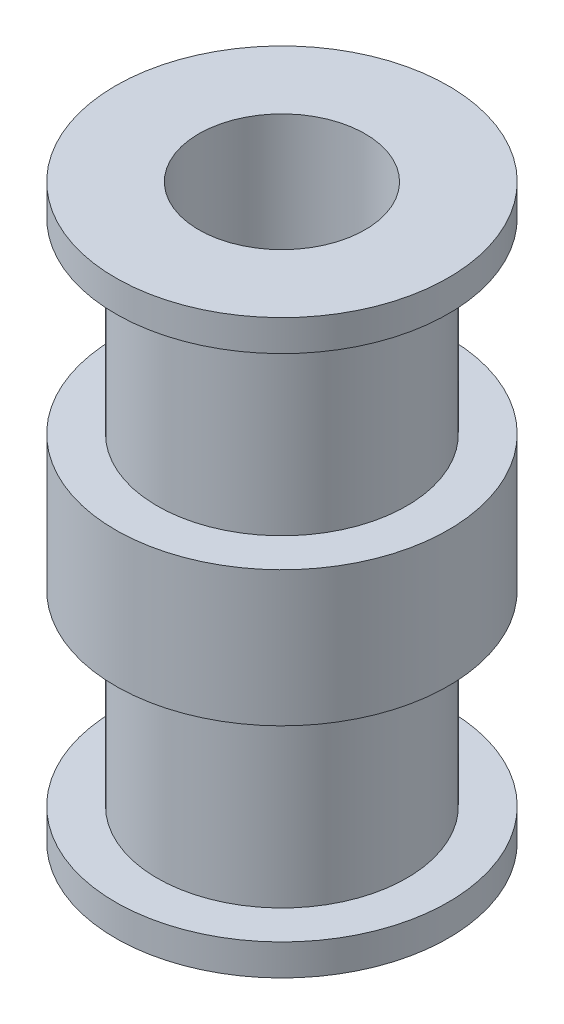
ISO-10303-21;
HEADER;
FILE_DESCRIPTION(('STEP AP214'),'2;1');
FILE_NAME('part.step','',(''),(''),'','','');
FILE_SCHEMA(('AUTOMOTIVE_DESIGN { 1 0 10303 214 1 1 1 1 }'));
ENDSEC;
DATA;
#1=APPLICATION_CONTEXT('core data for automotive mechanical design processes');
#2=APPLICATION_PROTOCOL_DEFINITION('international standard','automotive_design',2000,#1);
#3=PRODUCT_CONTEXT('',#1,'mechanical');
#4=PRODUCT('Part','Part','',(#3));
#5=PRODUCT_RELATED_PRODUCT_CATEGORY('part','',(#4));
#6=PRODUCT_DEFINITION_FORMATION('','',#4);
#7=PRODUCT_DEFINITION_CONTEXT('part definition',#1,'design');
#8=PRODUCT_DEFINITION('design','',#6,#7);
#9=PRODUCT_DEFINITION_SHAPE('','',#8);
#10=(LENGTH_UNIT() NAMED_UNIT(*) SI_UNIT(.MILLI.,.METRE.));
#11=(NAMED_UNIT(*) PLANE_ANGLE_UNIT() SI_UNIT($,.RADIAN.));
#12=(NAMED_UNIT(*) SI_UNIT($,.STERADIAN.) SOLID_ANGLE_UNIT());
#13=UNCERTAINTY_MEASURE_WITH_UNIT(LENGTH_MEASURE(1.E-05),#10,'distance_accuracy_value','');
#14=(GEOMETRIC_REPRESENTATION_CONTEXT(3) GLOBAL_UNCERTAINTY_ASSIGNED_CONTEXT((#13)) GLOBAL_UNIT_ASSIGNED_CONTEXT((#10,
#11,#12)) REPRESENTATION_CONTEXT('',''));
#15=CARTESIAN_POINT('',(0.,0.,0.));
#16=DIRECTION('',(0.,0.,1.));
#17=DIRECTION('',(1.,0.,0.));
#18=AXIS2_PLACEMENT_3D('',#15,#16,#17);
#19=CARTESIAN_POINT('',(0.,-22.5,0.));
#20=DIRECTION('',(0.,-1.,0.));
#21=DIRECTION('',(1.,0.,0.));
#22=AXIS2_PLACEMENT_3D('',#19,#20,#21);
#23=PLANE('',#22);
#24=CARTESIAN_POINT('',(0.,-22.5,0.));
#25=DIRECTION('',(0.,-1.,0.));
#26=DIRECTION('',(1.,0.,0.));
#27=AXIS2_PLACEMENT_3D('',#24,#25,#26);
#28=CIRCLE('',#27,4.);
#29=CARTESIAN_POINT('',(4.,-22.5,0.));
#30=VERTEX_POINT('',#29);
#31=EDGE_CURVE('E87',#30,#30,#28,.F.);
#32=ORIENTED_EDGE('',*,*,#31,.T.);
#33=EDGE_LOOP('',(#32));
#34=FACE_BOUND('',#33,.T.);
#35=CARTESIAN_POINT('',(0.,-22.5,0.));
#36=DIRECTION('',(0.,1.,0.));
#37=DIRECTION('',(-1.,0.,0.));
#38=AXIS2_PLACEMENT_3D('',#35,#36,#37);
#39=CIRCLE('',#38,8.);
#40=CARTESIAN_POINT('',(-7.99999999999996,-22.5,0.));
#41=VERTEX_POINT('',#40);
#42=EDGE_CURVE('E10',#41,#41,#39,.T.);
#43=ORIENTED_EDGE('',*,*,#42,.F.);
#44=EDGE_LOOP('',(#43));
#45=FACE_BOUND('',#44,.T.);
#46=ADVANCED_FACE('F37',(#34,#45),#23,.T.);
#47=CARTESIAN_POINT('',(0.,291.267844828274,0.));
#48=DIRECTION('',(0.,1.,0.));
#49=DIRECTION('',(-1.,0.,0.));
#50=AXIS2_PLACEMENT_3D('',#47,#48,#49);
#51=CYLINDRICAL_SURFACE('',#50,8.);
#52=ORIENTED_EDGE('',*,*,#42,.T.);
#53=EDGE_LOOP('',(#52));
#54=FACE_BOUND('',#53,.T.);
#55=CARTESIAN_POINT('',(0.,-21.,0.));
#56=DIRECTION('',(0.,1.,0.));
#57=DIRECTION('',(-1.,0.,0.));
#58=AXIS2_PLACEMENT_3D('',#55,#56,#57);
#59=CIRCLE('',#58,8.);
#60=CARTESIAN_POINT('',(-7.99999999999996,-21.,0.));
#61=VERTEX_POINT('',#60);
#62=EDGE_CURVE('E50',#61,#61,#59,.T.);
#63=ORIENTED_EDGE('',*,*,#62,.F.);
#64=EDGE_LOOP('',(#63));
#65=FACE_BOUND('',#64,.T.);
#66=ADVANCED_FACE('F112',(#54,#65),#51,.T.);
#67=CARTESIAN_POINT('',(-5.99999999999996,-21.,0.));
#68=DIRECTION('',(0.,1.,0.));
#69=DIRECTION('',(-1.,0.,0.));
#70=AXIS2_PLACEMENT_3D('',#67,#68,#69);
#71=PLANE('',#70);
#72=ORIENTED_EDGE('',*,*,#62,.T.);
#73=EDGE_LOOP('',(#72));
#74=FACE_BOUND('',#73,.T.);
#75=CARTESIAN_POINT('',(0.,-21.,0.));
#76=DIRECTION('',(0.,1.,0.));
#77=DIRECTION('',(-1.,0.,0.));
#78=AXIS2_PLACEMENT_3D('',#75,#76,#77);
#79=CIRCLE('',#78,6.);
#80=CARTESIAN_POINT('',(-5.99999999999996,-21.,0.));
#81=VERTEX_POINT('',#80);
#82=EDGE_CURVE('E56',#81,#81,#79,.T.);
#83=ORIENTED_EDGE('',*,*,#82,.F.);
#84=EDGE_LOOP('',(#83));
#85=FACE_BOUND('',#84,.T.);
#86=ADVANCED_FACE('F109',(#74,#85),#71,.T.);
#87=CARTESIAN_POINT('',(0.,291.267844828274,0.));
#88=DIRECTION('',(0.,1.,0.));
#89=DIRECTION('',(-1.,0.,0.));
#90=AXIS2_PLACEMENT_3D('',#87,#88,#89);
#91=CYLINDRICAL_SURFACE('',#90,6.);
#92=ORIENTED_EDGE('',*,*,#82,.T.);
#93=EDGE_LOOP('',(#92));
#94=FACE_BOUND('',#93,.T.);
#95=CARTESIAN_POINT('',(0.,-12.,0.));
#96=DIRECTION('',(0.,1.,0.));
#97=DIRECTION('',(-1.,0.,0.));
#98=AXIS2_PLACEMENT_3D('',#95,#96,#97);
#99=CIRCLE('',#98,6.);
#100=CARTESIAN_POINT('',(-5.99999999999996,-12.,0.));
#101=VERTEX_POINT('',#100);
#102=EDGE_CURVE('E125',#101,#101,#99,.T.);
#103=ORIENTED_EDGE('',*,*,#102,.F.);
#104=EDGE_LOOP('',(#103));
#105=FACE_BOUND('',#104,.T.);
#106=ADVANCED_FACE('F105',(#94,#105),#91,.T.);
#107=CARTESIAN_POINT('',(-5.99999999999996,-12.,0.));
#108=DIRECTION('',(0.,-1.,0.));
#109=DIRECTION('',(1.,0.,0.));
#110=AXIS2_PLACEMENT_3D('',#107,#108,#109);
#111=PLANE('',#110);
#112=ORIENTED_EDGE('',*,*,#102,.T.);
#113=EDGE_LOOP('',(#112));
#114=FACE_BOUND('',#113,.T.);
#115=CARTESIAN_POINT('',(0.,-12.,0.));
#116=DIRECTION('',(0.,1.,0.));
#117=DIRECTION('',(-1.,0.,0.));
#118=AXIS2_PLACEMENT_3D('',#115,#116,#117);
#119=CIRCLE('',#118,8.);
#120=CARTESIAN_POINT('',(-7.99999999999996,-12.,0.));
#121=VERTEX_POINT('',#120);
#122=EDGE_CURVE('E128',#121,#121,#119,.T.);
#123=ORIENTED_EDGE('',*,*,#122,.F.);
#124=EDGE_LOOP('',(#123));
#125=FACE_BOUND('',#124,.T.);
#126=ADVANCED_FACE('F99',(#114,#125),#111,.T.);
#127=CARTESIAN_POINT('',(0.,291.267844828274,0.));
#128=DIRECTION('',(0.,1.,0.));
#129=DIRECTION('',(-1.,0.,0.));
#130=AXIS2_PLACEMENT_3D('',#127,#128,#129);
#131=CYLINDRICAL_SURFACE('',#130,8.);
#132=CARTESIAN_POINT('',(-7.99999999999996,-10.0701498549836,0.));
#133=CARTESIAN_POINT('',(-7.99999885097238,-10.0701470058478,0.0697575486355165));
#134=CARTESIAN_POINT('',(-7.99907806242866,-10.0642907980968,0.139554702432852));
#135=CARTESIAN_POINT('',(-7.99549349048792,-10.0410280093452,0.277195657489052));
#136=CARTESIAN_POINT('',(-7.99282804422357,-10.0236104087318,0.345037530661659));
#137=CARTESIAN_POINT('',(-7.98605348582884,-9.97776002358029,0.476756269023703));
#138=CARTESIAN_POINT('',(-7.98194549781582,-9.9493358143028,0.540636176144954));
#139=CARTESIAN_POINT('',(-7.97273897019073,-9.8823005824128,0.662710625522304));
#140=CARTESIAN_POINT('',(-7.96764055931272,-9.84369088346563,0.720905905184158));
#141=CARTESIAN_POINT('',(-7.95697134207174,-9.75703333080662,0.830459955825815));
#142=CARTESIAN_POINT('',(-7.95139725696164,-9.70891635753848,0.88176373957133));
#143=CARTESIAN_POINT('',(-7.94043038065139,-9.60475888084916,0.975603844114127));
#144=CARTESIAN_POINT('',(-7.9350376002537,-9.54871790633351,1.01813964327097));
#145=CARTESIAN_POINT('',(-7.92501214063718,-9.42993071931175,1.09345272164443));
#146=CARTESIAN_POINT('',(-7.92038369893048,-9.36715011380272,1.12617636778997));
#147=CARTESIAN_POINT('',(-7.91245600871178,-9.23689914955471,1.18059340798534));
#148=CARTESIAN_POINT('',(-7.90915668151104,-9.16942906872833,1.20228745505034));
#149=CARTESIAN_POINT('',(-7.90429317255514,-9.03229440441172,1.23385779661086));
#150=CARTESIAN_POINT('',(-7.90271513266178,-8.96265206207421,1.2438285274375));
#151=CARTESIAN_POINT('',(-7.90143085535883,-8.82266626053729,1.25196184878814));
#152=CARTESIAN_POINT('',(-7.90172450144007,-8.75232284525059,1.25012517430236));
#153=CARTESIAN_POINT('',(-7.90413775227599,-8.61360133905727,1.23477290404448));
#154=CARTESIAN_POINT('',(-7.90624086092468,-8.54521124330704,1.2213628147985));
#155=CARTESIAN_POINT('',(-7.91201028172732,-8.41166385180395,1.1834096891688));
#156=CARTESIAN_POINT('',(-7.91567664153202,-8.34650665466334,1.1588663134207));
#157=CARTESIAN_POINT('',(-7.92417753427306,-8.22095549864503,1.09923458474696));
#158=CARTESIAN_POINT('',(-7.92901696543617,-8.16058295909708,1.06410186157779));
#159=CARTESIAN_POINT('',(-7.93931523075044,-8.04655008714084,0.984320290733232));
#160=CARTESIAN_POINT('',(-7.94477410894101,-7.99289023253987,0.93967076626513));
#161=CARTESIAN_POINT('',(-7.95576893124444,-7.89319473166695,0.841545444111715));
#162=CARTESIAN_POINT('',(-7.96130506817791,-7.84724827584888,0.787979002802748));
#163=CARTESIAN_POINT('',(-7.97177562673908,-7.76498328216365,0.673848473689734));
#164=CARTESIAN_POINT('',(-7.97671004531007,-7.72866479320519,0.613284350340715));
#165=CARTESIAN_POINT('',(-7.98542699513514,-7.6666808182724,0.486797963528303));
#166=CARTESIAN_POINT('',(-7.98920874270962,-7.6410225757171,0.420872093120288));
#167=CARTESIAN_POINT('',(-7.99518780000334,-7.60116687125998,0.285574767348439));
#168=CARTESIAN_POINT('',(-7.99738522604484,-7.58696856795035,0.216203565343659));
#169=CARTESIAN_POINT('',(-7.99993255863635,-7.57055521675849,0.0767541683819269));
#170=CARTESIAN_POINT('',(-8.00030135896426,-7.56821761549549,0.00669073075441028));
#171=CARTESIAN_POINT('',(-7.99920143245631,-7.57526620765157,-0.132827273205762));
#172=CARTESIAN_POINT('',(-7.99773276749818,-7.58465200627813,-0.202281859962519));
#173=CARTESIAN_POINT('',(-7.99313461846607,-7.61477904882366,-0.338236723132794));
#174=CARTESIAN_POINT('',(-7.99001392107689,-7.63546023411744,-0.404750631027963));
#175=CARTESIAN_POINT('',(-7.98246037841775,-7.68752740218297,-0.533367033928257));
#176=CARTESIAN_POINT('',(-7.97802746705032,-7.71891392420491,-0.595469306519648));
#177=CARTESIAN_POINT('',(-7.96829486370468,-7.79178585054686,-0.71403610112515));
#178=CARTESIAN_POINT('',(-7.96298864331707,-7.83334856502881,-0.77045256189181));
#179=CARTESIAN_POINT('',(-7.95211940232215,-7.92528589793746,-0.87555348253898));
#180=CARTESIAN_POINT('',(-7.94655636546335,-7.97566107458599,-0.92423745223504));
#181=CARTESIAN_POINT('',(-7.93574013768321,-8.08434045359217,-1.01294040388341));
#182=CARTESIAN_POINT('',(-7.93049020595398,-8.14271227854473,-1.05287699292059));
#183=CARTESIAN_POINT('',(-7.9209534640291,-8.26540789181423,-1.12237783863316));
#184=CARTESIAN_POINT('',(-7.91666662610995,-8.3297315087283,-1.15194239389048));
#185=CARTESIAN_POINT('',(-7.90956535676175,-8.46226467534065,-1.19973385972494));
#186=CARTESIAN_POINT('',(-7.90674541174476,-8.53045858936637,-1.21800327473953));
#187=CARTESIAN_POINT('',(-7.90288285140393,-8.66899442681554,-1.24282061020264));
#188=CARTESIAN_POINT('',(-7.90184010192216,-8.73933618769306,-1.24936941542496));
#189=CARTESIAN_POINT('',(-7.90165529022439,-8.87934921293729,-1.25053726345375));
#190=CARTESIAN_POINT('',(-7.90249258021447,-8.94901940345031,-1.2452859027421));
#191=CARTESIAN_POINT('',(-7.90592849470911,-9.0864725035557,-1.22328111627948));
#192=CARTESIAN_POINT('',(-7.90852711539972,-9.15425541723442,-1.20652771543479));
#193=CARTESIAN_POINT('',(-7.91518544427449,-9.28596876830382,-1.16204164945924));
#194=CARTESIAN_POINT('',(-7.919243844767,-9.34990259411277,-1.13431880869289));
#195=CARTESIAN_POINT('',(-7.92836592023694,-9.4722326618217,-1.06869384273207));
#196=CARTESIAN_POINT('',(-7.93342963505409,-9.53062868412778,-1.03079131410442));
#197=CARTESIAN_POINT('',(-7.94405784046126,-9.64088262704698,-0.945415040695388));
#198=CARTESIAN_POINT('',(-7.94962700580141,-9.69266595329048,-0.897845535473833));
#199=CARTESIAN_POINT('',(-7.96060021820363,-9.78756047317693,-0.794687973191014));
#200=CARTESIAN_POINT('',(-7.96600422670057,-9.83066965427951,-0.739098060392156));
#201=CARTESIAN_POINT('',(-7.97607551228346,-9.90722546649935,-0.621083429421703));
#202=CARTESIAN_POINT('',(-7.9807381721513,-9.94061254136338,-0.558619686071187));
#203=CARTESIAN_POINT('',(-7.98875629919436,-9.99637035308005,-0.42892594117889));
#204=CARTESIAN_POINT('',(-7.99211310071056,-10.0187523412628,-0.36170088829088));
#205=CARTESIAN_POINT('',(-7.99638722932436,-10.0468663655289,-0.245157119955797));
#206=CARTESIAN_POINT('',(-7.99773495813057,-10.0555841002981,-0.196552787825812));
#207=CARTESIAN_POINT('',(-7.99954174348807,-10.0672268116731,-0.0986388989252911));
#208=CARTESIAN_POINT('',(-8.00000081253978,-10.0701518697623,-0.0493293520845594));
#209=CARTESIAN_POINT('',(-7.99999999999996,-10.0701498549836,0.));
#210=B_SPLINE_CURVE_WITH_KNOTS('',3,(#132,#133,#134,#135,#136,#137,#138,#139,#140,#141,#142,
#143,#144,#145,#146,#147,#148,#149,#150,#151,#152,#153,#154,#155,#156,#157,#158,#159,#160,#161,
#162,#163,#164,#165,#166,#167,#168,#169,#170,#171,#172,#173,#174,#175,#176,#177,#178,#179,#180,
#181,#182,#183,#184,#185,#186,#187,#188,#189,#190,#191,#192,#193,#194,#195,#196,#197,#198,#199,
#200,#201,#202,#203,#204,#205,#206,#207,#208,#209),.UNSPECIFIED.,.T.,.F.,(4,2,2,2,2,2,2,2,2,2,2,
2,2,2,2,2,2,2,2,2,2,2,2,2,2,2,2,2,2,2,2,2,2,2,2,2,2,2,4),(0.,0.209092370238745,
0.418384321264007,0.627513539720513,0.836615593960149,1.047297840761,1.25799261822711,
1.46981889302879,1.68163262504619,1.89172815567498,2.10181060835272,2.3099978801129,
2.51819149825525,2.72726988701174,2.93636314946034,3.14772866167183,3.35909524756913,
3.57060521877282,3.78209965914933,3.99140427002957,4.20070183264178,4.40889722378283,
4.61710310371015,4.82694270734835,5.03679560800708,5.24854740124796,5.4602930982449,
5.67123705197566,5.88216508114648,6.09078790799345,6.29941028309448,6.50784623483309,
6.71629044835674,6.9269100615777,7.1375784857115,7.34951152099921,7.5612274282814,
7.7090900817577,7.85695065529354),.UNSPECIFIED.);
#211=CARTESIAN_POINT('',(-7.99999999999996,-10.0701498549836,0.));
#212=VERTEX_POINT('',#211);
#213=EDGE_CURVE('E67',#212,#212,#210,.T.);
#214=ORIENTED_EDGE('',*,*,#213,.F.);
#215=EDGE_LOOP('',(#214));
#216=FACE_BOUND('',#215,.T.);
#217=CARTESIAN_POINT('',(1.25,-8.82014985498358,-7.90174031463956));
#218=CARTESIAN_POINT('',(1.24999714589602,-8.88990154414718,-7.90174151747695));
#219=CARTESIAN_POINT('',(1.24414188871431,-8.95969285380582,-7.90267390208987));
#220=CARTESIAN_POINT('',(1.2208832182291,-9.09732166946616,-7.90629985526834));
#221=CARTESIAN_POINT('',(1.20346876400912,-9.16515724271952,-7.90899510762377));
#222=CARTESIAN_POINT('',(1.15762758023421,-9.29686264981243,-7.91583424559869));
#223=CARTESIAN_POINT('',(1.12920957460922,-9.36073557892074,-7.919976983357));
#224=CARTESIAN_POINT('',(1.06218895908233,-9.48279830040286,-7.92924294913634));
#225=CARTESIAN_POINT('',(1.02358765802571,-9.54098882181287,-7.93436605112925));
#226=CARTESIAN_POINT('',(0.936938650554447,-9.6505480975597,-7.94506519257156));
#227=CARTESIAN_POINT('',(0.888819943087469,-9.70186039218353,-7.95064443921898));
#228=CARTESIAN_POINT('',(0.784655404938387,-9.79571696519842,-7.96159865413737));
#229=CARTESIAN_POINT('',(0.72860912658425,-9.83826074809569,-7.96697361085028));
#230=CARTESIAN_POINT('',(0.609817145928799,-9.91358229350419,-7.97694733576469));
#231=CARTESIAN_POINT('',(0.547037963178643,-9.94630785697082,-7.98154190081689));
#232=CARTESIAN_POINT('',(0.416790085897381,-10.0007288323461,-7.98940157455279));
#233=CARTESIAN_POINT('',(0.349321660068406,-10.0224248756749,-7.99266675933898));
#234=CARTESIAN_POINT('',(0.212192662724405,-10.0539992144617,-7.99747714289859));
#235=CARTESIAN_POINT('',(0.142554380080376,-10.0639721795178,-7.99903611302523));
#236=CARTESIAN_POINT('',(0.00257657177533563,-10.0721113766353,-8.00030565490477));
#237=CARTESIAN_POINT('',(-0.0677629114945934,-10.0702783181595,-8.00001633772735));
#238=CARTESIAN_POINT('',(-0.206500044861075,-10.0549318918447,-7.99763286949342));
#239=CARTESIAN_POINT('',(-0.274909271287587,-10.0415203855634,-7.99555445847991));
#240=CARTESIAN_POINT('',(-0.408494187671745,-10.0035578406723,-7.98984386977642));
#241=CARTESIAN_POINT('',(-0.473669788676087,-9.97900649580652,-7.98621164936935));
#242=CARTESIAN_POINT('',(-0.599243713396235,-9.91935802705356,-7.97777459210141));
#243=CARTESIAN_POINT('',(-0.659621495359184,-9.88421835226961,-7.97296503885208));
#244=CARTESIAN_POINT('',(-0.773661928266065,-9.80442181466896,-7.96270873510231));
#245=CARTESIAN_POINT('',(-0.827324099796619,-9.75976427300609,-7.95726193916408));
#246=CARTESIAN_POINT('',(-0.927010992600116,-9.66163311144695,-7.94626939127781));
#247=CARTESIAN_POINT('',(-0.972948128065372,-9.60807052178615,-7.94072320355104));
#248=CARTESIAN_POINT('',(-1.05519613023743,-9.49395107264252,-7.93021346922372));
#249=CARTESIAN_POINT('',(-1.09150692769167,-9.43339416284655,-7.9252499268149));
#250=CARTESIAN_POINT('',(-1.15348530317843,-9.30691004093068,-7.91646746408066));
#251=CARTESIAN_POINT('',(-1.1791433194208,-9.24097806744686,-7.91264957292445));
#252=CARTESIAN_POINT('',(-1.21899671563834,-9.10566743063085,-7.90660844954739));
#253=CARTESIAN_POINT('',(-1.23319297597629,-9.03628903244872,-7.9043850948537));
#254=CARTESIAN_POINT('',(-1.24959859618928,-8.89683580334598,-7.90180818484429));
#255=CARTESIAN_POINT('',(-1.25193236705635,-8.82677595488621,-7.90143522402998));
#256=CARTESIAN_POINT('',(-1.24487739516592,-8.68726603733463,-7.90254974885909));
#257=CARTESIAN_POINT('',(-1.23548904827164,-8.61781594773065,-7.90403717167621));
#258=CARTESIAN_POINT('',(-1.20536206277948,-8.48188595125035,-7.90868700525928));
#259=CARTESIAN_POINT('',(-1.1846858939099,-8.41539185566378,-7.91184019416676));
#260=CARTESIAN_POINT('',(-1.13263536120966,-8.28681286943164,-7.91945862198423));
#261=CARTESIAN_POINT('',(-1.10126042801475,-8.22472821365907,-7.92392393072055));
#262=CARTESIAN_POINT('',(-1.02840599585147,-8.10617421415918,-7.93370896103555));
#263=CARTESIAN_POINT('',(-0.986846255467356,-8.0497547405336,-7.93903534729881));
#264=CARTESIAN_POINT('',(-0.894912969976414,-7.94464636455948,-7.94992252348104));
#265=CARTESIAN_POINT('',(-0.844538882607103,-7.89595793818007,-7.95548332780552));
#266=CARTESIAN_POINT('',(-0.735857733829041,-7.80724421966585,-7.96627369437275));
#267=CARTESIAN_POINT('',(-0.677482820794919,-7.76730156676855,-7.97149979210822));
#268=CARTESIAN_POINT('',(-0.554779305146687,-7.69779009498847,-7.98097744670418));
#269=CARTESIAN_POINT('',(-0.490450876581246,-7.66822097296061,-7.98522903204153));
#270=CARTESIAN_POINT('',(-0.357919831889164,-7.62042671734151,-7.99226348838417));
#271=CARTESIAN_POINT('',(-0.289733573808545,-7.60215710626388,-7.9950521112786));
#272=CARTESIAN_POINT('',(-0.151213974885374,-7.57733678864718,-7.99887064894726));
#273=CARTESIAN_POINT('',(-0.0808807888272175,-7.5707852393056,-7.99990069020438));
#274=CARTESIAN_POINT('',(0.0591360825941368,-7.56960892865598,-8.00008455063986));
#275=CARTESIAN_POINT('',(0.128818714429899,-7.57485798266221,-7.99925822019994));
#276=CARTESIAN_POINT('',(0.266297297732435,-7.59686251307375,-7.99586239007131));
#277=CARTESIAN_POINT('',(0.334093256790797,-7.61361794317275,-7.99329289739779));
#278=CARTESIAN_POINT('',(0.465834425214724,-7.65811348483981,-7.98669820710743));
#279=CARTESIAN_POINT('',(0.529782898258214,-7.68584413077422,-7.98267426414775));
#280=CARTESIAN_POINT('',(0.652139036266005,-7.75148927424442,-7.97361166155728));
#281=CARTESIAN_POINT('',(0.710546490726959,-7.78940415847003,-7.96857296339862));
#282=CARTESIAN_POINT('',(0.820801095929352,-7.87479457658844,-7.9579764111196));
#283=CARTESIAN_POINT('',(0.872575847413247,-7.9223630121381,-7.95241381770965));
#284=CARTESIAN_POINT('',(0.96745356368349,-8.02551483364878,-7.94143064388638));
#285=CARTESIAN_POINT('',(1.0105544928104,-8.08110009583658,-7.936010097069));
#286=CARTESIAN_POINT('',(1.08710075771188,-8.19911040712927,-7.92588898732018));
#287=CARTESIAN_POINT('',(1.12048522074144,-8.26157533432067,-7.92119304654734));
#288=CARTESIAN_POINT('',(1.17623782803743,-8.39127146383114,-7.91310716729584));
#289=CARTESIAN_POINT('',(1.19861725029602,-8.4584977055505,-7.90971589257156));
#290=CARTESIAN_POINT('',(1.22672453478634,-8.57503472482713,-7.90539548341694));
#291=CARTESIAN_POINT('',(1.23543924637686,-8.62363065497422,-7.90403218990729));
#292=CARTESIAN_POINT('',(1.24707794539411,-8.72152774550857,-7.90220418687747));
#293=CARTESIAN_POINT('',(1.25000201811811,-8.77082889549702,-7.90173946412117));
#294=CARTESIAN_POINT('',(1.25,-8.82014985498358,-7.90174031463956));
#295=B_SPLINE_CURVE_WITH_KNOTS('',3,(#217,#218,#219,#220,#221,#222,#223,#224,#225,#226,#227,
#228,#229,#230,#231,#232,#233,#234,#235,#236,#237,#238,#239,#240,#241,#242,#243,#244,#245,#246,
#247,#248,#249,#250,#251,#252,#253,#254,#255,#256,#257,#258,#259,#260,#261,#262,#263,#264,#265,
#266,#267,#268,#269,#270,#271,#272,#273,#274,#275,#276,#277,#278,#279,#280,#281,#282,#283,#284,
#285,#286,#287,#288,#289,#290,#291,#292,#293,#294),.UNSPECIFIED.,.T.,.F.,(4,2,2,2,2,2,2,2,2,2,2,
2,2,2,2,2,2,2,2,2,2,2,2,2,2,2,2,2,2,2,2,2,2,2,2,2,2,2,4),(0.,0.209074763941293,0.41834951626796,
0.627458688206187,0.836540996707036,1.04724629023635,1.25796348710333,1.4697818900924,
1.68158816549379,1.89167198756851,2.10174318513255,2.30998489573485,2.5182323316538,
2.72732806463509,2.93643871601874,3.14778021695736,3.3591232382602,3.57065555017417,
3.78217161301618,3.99146470015321,4.20075071952324,4.40889006724113,4.61704049339771,
4.82688676416582,5.03674594931015,5.24850985997734,5.46026758176487,5.67118638114212,
5.88209000991818,6.09074917034593,6.29940749105005,6.50788624405681,6.71637291400441,
6.92697020198998,7.1376168575629,7.34955610829279,7.56127770816942,7.70911527287133,
7.85695065988004),.UNSPECIFIED.);
#296=CARTESIAN_POINT('',(1.25,-8.82014985498358,-7.90174031463956));
#297=VERTEX_POINT('',#296);
#298=EDGE_CURVE('E66',#297,#297,#295,.T.);
#299=ORIENTED_EDGE('',*,*,#298,.F.);
#300=EDGE_LOOP('',(#299));
#301=FACE_BOUND('',#300,.T.);
#302=ORIENTED_EDGE('',*,*,#122,.T.);
#303=EDGE_LOOP('',(#302));
#304=FACE_BOUND('',#303,.T.);
#305=CARTESIAN_POINT('',(0.,-5.50000000000001,0.));
#306=DIRECTION('',(0.,1.,0.));
#307=DIRECTION('',(-1.,0.,0.));
#308=AXIS2_PLACEMENT_3D('',#305,#306,#307);
#309=CIRCLE('',#308,8.);
#310=CARTESIAN_POINT('',(-7.99999999999996,-5.50000000000001,0.));
#311=VERTEX_POINT('',#310);
#312=EDGE_CURVE('E134',#311,#311,#309,.T.);
#313=ORIENTED_EDGE('',*,*,#312,.F.);
#314=EDGE_LOOP('',(#313));
#315=FACE_BOUND('',#314,.T.);
#316=ADVANCED_FACE('F93',(#216,#301,#304,#315),#131,.T.);
#317=CARTESIAN_POINT('',(-5.99999999999996,-5.5,0.));
#318=DIRECTION('',(0.,1.,0.));
#319=DIRECTION('',(-1.,0.,0.));
#320=AXIS2_PLACEMENT_3D('',#317,#318,#319);
#321=PLANE('',#320);
#322=ORIENTED_EDGE('',*,*,#312,.T.);
#323=EDGE_LOOP('',(#322));
#324=FACE_BOUND('',#323,.T.);
#325=CARTESIAN_POINT('',(0.,-5.50000000000001,0.));
#326=DIRECTION('',(0.,1.,0.));
#327=DIRECTION('',(-1.,0.,0.));
#328=AXIS2_PLACEMENT_3D('',#325,#326,#327);
#329=CIRCLE('',#328,6.);
#330=CARTESIAN_POINT('',(-5.99999999999996,-5.50000000000001,0.));
#331=VERTEX_POINT('',#330);
#332=EDGE_CURVE('E138',#331,#331,#329,.T.);
#333=ORIENTED_EDGE('',*,*,#332,.F.);
#334=EDGE_LOOP('',(#333));
#335=FACE_BOUND('',#334,.T.);
#336=ADVANCED_FACE('F98',(#324,#335),#321,.T.);
#337=CARTESIAN_POINT('',(0.,291.267844828274,0.));
#338=DIRECTION('',(0.,1.,0.));
#339=DIRECTION('',(-1.,0.,0.));
#340=AXIS2_PLACEMENT_3D('',#337,#338,#339);
#341=CYLINDRICAL_SURFACE('',#340,6.);
#342=ORIENTED_EDGE('',*,*,#332,.T.);
#343=EDGE_LOOP('',(#342));
#344=FACE_BOUND('',#343,.T.);
#345=CARTESIAN_POINT('',(0.,3.5,0.));
#346=DIRECTION('',(0.,1.,0.));
#347=DIRECTION('',(-1.,0.,0.));
#348=AXIS2_PLACEMENT_3D('',#345,#346,#347);
#349=CIRCLE('',#348,6.);
#350=CARTESIAN_POINT('',(-5.99999999999997,3.5,0.));
#351=VERTEX_POINT('',#350);
#352=EDGE_CURVE('E142',#351,#351,#349,.T.);
#353=ORIENTED_EDGE('',*,*,#352,.F.);
#354=EDGE_LOOP('',(#353));
#355=FACE_BOUND('',#354,.T.);
#356=ADVANCED_FACE('F174',(#344,#355),#341,.T.);
#357=CARTESIAN_POINT('',(-5.99999999999997,3.5,0.));
#358=DIRECTION('',(0.,-1.,0.));
#359=DIRECTION('',(1.,0.,0.));
#360=AXIS2_PLACEMENT_3D('',#357,#358,#359);
#361=PLANE('',#360);
#362=ORIENTED_EDGE('',*,*,#352,.T.);
#363=EDGE_LOOP('',(#362));
#364=FACE_BOUND('',#363,.T.);
#365=CARTESIAN_POINT('',(0.,3.5,0.));
#366=DIRECTION('',(0.,1.,0.));
#367=DIRECTION('',(-1.,0.,0.));
#368=AXIS2_PLACEMENT_3D('',#365,#366,#367);
#369=CIRCLE('',#368,8.);
#370=CARTESIAN_POINT('',(-7.99999999999997,3.5,0.));
#371=VERTEX_POINT('',#370);
#372=EDGE_CURVE('E146',#371,#371,#369,.T.);
#373=ORIENTED_EDGE('',*,*,#372,.F.);
#374=EDGE_LOOP('',(#373));
#375=FACE_BOUND('',#374,.T.);
#376=ADVANCED_FACE('F168',(#364,#375),#361,.T.);
#377=CARTESIAN_POINT('',(0.,291.267844828274,0.));
#378=DIRECTION('',(0.,1.,0.));
#379=DIRECTION('',(-1.,0.,0.));
#380=AXIS2_PLACEMENT_3D('',#377,#378,#379);
#381=CYLINDRICAL_SURFACE('',#380,8.);
#382=ORIENTED_EDGE('',*,*,#372,.T.);
#383=EDGE_LOOP('',(#382));
#384=FACE_BOUND('',#383,.T.);
#385=CARTESIAN_POINT('',(0.,5.,0.));
#386=DIRECTION('',(0.,1.,0.));
#387=DIRECTION('',(-1.,0.,0.));
#388=AXIS2_PLACEMENT_3D('',#385,#386,#387);
#389=CIRCLE('',#388,8.);
#390=CARTESIAN_POINT('',(-7.99999999999996,5.,0.));
#391=VERTEX_POINT('',#390);
#392=EDGE_CURVE('E150',#391,#391,#389,.T.);
#393=ORIENTED_EDGE('',*,*,#392,.F.);
#394=EDGE_LOOP('',(#393));
#395=FACE_BOUND('',#394,.T.);
#396=ADVANCED_FACE('F164',(#384,#395),#381,.T.);
#397=CARTESIAN_POINT('',(0.,5.,0.));
#398=DIRECTION('',(0.,1.,0.));
#399=DIRECTION('',(-1.,0.,0.));
#400=AXIS2_PLACEMENT_3D('',#397,#398,#399);
#401=PLANE('',#400);
#402=CARTESIAN_POINT('',(0.,5.,0.));
#403=DIRECTION('',(0.,1.,0.));
#404=DIRECTION('',(-1.,0.,0.));
#405=AXIS2_PLACEMENT_3D('',#402,#403,#404);
#406=CIRCLE('',#405,4.);
#407=CARTESIAN_POINT('',(-4.,5.,0.));
#408=VERTEX_POINT('',#407);
#409=EDGE_CURVE('E91',#408,#408,#406,.T.);
#410=ORIENTED_EDGE('',*,*,#409,.F.);
#411=EDGE_LOOP('',(#410));
#412=FACE_BOUND('',#411,.T.);
#413=ORIENTED_EDGE('',*,*,#392,.T.);
#414=EDGE_LOOP('',(#413));
#415=FACE_BOUND('',#414,.T.);
#416=ADVANCED_FACE('F161',(#412,#415),#401,.T.);
#417=CARTESIAN_POINT('',(0.,-22.501,0.));
#418=DIRECTION('',(0.,1.,0.));
#419=DIRECTION('',(-1.,0.,0.));
#420=AXIS2_PLACEMENT_3D('',#417,#418,#419);
#421=CYLINDRICAL_SURFACE('',#420,4.);
#422=CARTESIAN_POINT('',(-4.,-10.0701498549836,0.));
#423=CARTESIAN_POINT('',(-3.99999965877989,-10.070149408396,0.0684391851745464));
#424=CARTESIAN_POINT('',(-3.99822694984841,-10.0645106280391,0.136883052502859));
#425=CARTESIAN_POINT('',(-3.99132894088807,-10.0421636134443,0.271769209588448));
#426=CARTESIAN_POINT('',(-3.98620288199859,-10.0254528736192,0.338211042725908));
#427=CARTESIAN_POINT('',(-3.97315815697909,-9.98158048378785,0.467128543650807));
#428=CARTESIAN_POINT('',(-3.96524381499025,-9.95443501033063,0.529610176985805));
#429=CARTESIAN_POINT('',(-3.94743969161092,-9.89053253730526,0.649134802346462));
#430=CARTESIAN_POINT('',(-3.93754959899905,-9.85377402320301,0.706176935444887));
#431=CARTESIAN_POINT('',(-3.91650213740282,-9.77049386296624,0.814965334952284));
#432=CARTESIAN_POINT('',(-3.90531715926989,-9.72372896992252,0.866520028156664));
#433=CARTESIAN_POINT('',(-3.88310046374208,-9.62228146257005,0.961197382036998));
#434=CARTESIAN_POINT('',(-3.87206877523457,-9.56759737748905,1.0043184728987));
#435=CARTESIAN_POINT('',(-3.85111144698172,-9.45020529117551,1.08194336483114));
#436=CARTESIAN_POINT('',(-3.84121988301795,-9.38733237745638,1.1162078415013));
#437=CARTESIAN_POINT('',(-3.82407801799234,-9.25635754000172,1.17359741076672));
#438=CARTESIAN_POINT('',(-3.81682702128688,-9.18825699918967,1.19672543771946));
#439=CARTESIAN_POINT('',(-3.806076069845,-9.05092177753153,1.23048459930035));
#440=CARTESIAN_POINT('',(-3.80246972929508,-8.98178301134474,1.24147110007866));
#441=CARTESIAN_POINT('',(-3.7991005514095,-8.8425567360717,1.25174555036989));
#442=CARTESIAN_POINT('',(-3.79933669227334,-8.77246948416194,1.25103660995773));
#443=CARTESIAN_POINT('',(-3.80353189075437,-8.63627539471462,1.23821824732741));
#444=CARTESIAN_POINT('',(-3.80734341745948,-8.57012072912203,1.22656057869385));
#445=CARTESIAN_POINT('',(-3.81802025652488,-8.44075769844625,1.19290813355628));
#446=CARTESIAN_POINT('',(-3.82488589343114,-8.3775496472748,1.17091225844552));
#447=CARTESIAN_POINT('',(-3.84101044014296,-8.25479791055096,1.11688874681279));
#448=CARTESIAN_POINT('',(-3.85030284660824,-8.19532124429161,1.08471925662084));
#449=CARTESIAN_POINT('',(-3.87021856580069,-8.08246208710447,1.01136020737851));
#450=CARTESIAN_POINT('',(-3.8808422239455,-8.02908118472988,0.970168305215797));
#451=CARTESIAN_POINT('',(-3.90281527800492,-7.92737491156661,0.87771695418215));
#452=CARTESIAN_POINT('',(-3.91417569605695,-7.87939029720391,0.826084570592844));
#453=CARTESIAN_POINT('',(-3.9359157075958,-7.79267796140391,0.71536440809556));
#454=CARTESIAN_POINT('',(-3.94629522838372,-7.75395092576438,0.65627607734905));
#455=CARTESIAN_POINT('',(-3.96501294890191,-7.68662216638232,0.531664610465485));
#456=CARTESIAN_POINT('',(-3.97333460648207,-7.65810171951962,0.46609490691931));
#457=CARTESIAN_POINT('',(-3.98687955828553,-7.61259685413202,0.330767977782676));
#458=CARTESIAN_POINT('',(-3.99210379325151,-7.59560893274519,0.26101203072464));
#459=CARTESIAN_POINT('',(-3.99871389395014,-7.57423181240461,0.122185157290377));
#460=CARTESIAN_POINT('',(-4.00024022895439,-7.56938131139006,0.053191848788874));
#461=CARTESIAN_POINT('',(-3.99969799730981,-7.57111608162091,-0.0846303057325535));
#462=CARTESIAN_POINT('',(-3.99762995581125,-7.57769968230618,-0.153459174306475));
#463=CARTESIAN_POINT('',(-3.99022363769772,-7.60174544758998,-0.287219332975822));
#464=CARTESIAN_POINT('',(-3.98496793110725,-7.6189331225961,-0.352204978420918));
#465=CARTESIAN_POINT('',(-3.97180121379252,-7.66336420735027,-0.478351928861336));
#466=CARTESIAN_POINT('',(-3.96388987514204,-7.69060885900848,-0.539512760448987));
#467=CARTESIAN_POINT('',(-3.94598542759568,-7.75512307153237,-0.657932406672203));
#468=CARTESIAN_POINT('',(-3.9359462681821,-7.79262084248079,-0.715059739787927));
#469=CARTESIAN_POINT('',(-3.91493410002888,-7.87630306510059,-0.822365850960069));
#470=CARTESIAN_POINT('',(-3.90396083845862,-7.92248987272669,-0.87254273804331));
#471=CARTESIAN_POINT('',(-3.88176994885248,-8.02440874503726,-0.966587462919632));
#472=CARTESIAN_POINT('',(-3.87055986714446,-8.08044651872883,-1.01012652339771));
#473=CARTESIAN_POINT('',(-3.84961947087602,-8.19927647135431,-1.08721250244907));
#474=CARTESIAN_POINT('',(-3.839889132814,-8.262068542988,-1.12075957972522));
#475=CARTESIAN_POINT('',(-3.82311782360754,-8.39249502786943,-1.17670083481139));
#476=CARTESIAN_POINT('',(-3.81606646468027,-8.46010950448827,-1.19913819558884));
#477=CARTESIAN_POINT('',(-3.80551170941213,-8.59842234830736,-1.23222894320962));
#478=CARTESIAN_POINT('',(-3.80200696302675,-8.66911953135488,-1.24288681414608));
#479=CARTESIAN_POINT('',(-3.79908292712495,-8.80815394253781,-1.25179406157539));
#480=CARTESIAN_POINT('',(-3.79948604683077,-8.8764533087965,-1.25058279621956));
#481=CARTESIAN_POINT('',(-3.80390090472383,-9.01182443990275,-1.23708818129473));
#482=CARTESIAN_POINT('',(-3.80791247457319,-9.07889626186757,-1.22480534822558));
#483=CARTESIAN_POINT('',(-3.81896814158112,-9.20894389458535,-1.18987729913377));
#484=CARTESIAN_POINT('',(-3.82596698183474,-9.27196529607958,-1.16738642405943));
#485=CARTESIAN_POINT('',(-3.84219704261348,-9.39339026851492,-1.11280227335063));
#486=CARTESIAN_POINT('',(-3.85142871716522,-9.45179289706125,-1.08070704444254));
#487=CARTESIAN_POINT('',(-3.8715348703158,-9.56479582542414,-1.00635675013475));
#488=CARTESIAN_POINT('',(-3.88245948922441,-9.61915798448401,-0.963753335241269));
#489=CARTESIAN_POINT('',(-3.90448998821726,-9.72013618309537,-0.870208996404845));
#490=CARTESIAN_POINT('',(-3.91559591606795,-9.76675014397458,-0.8192658423444));
#491=CARTESIAN_POINT('',(-3.93717271952329,-9.85243239334656,-0.708486662823331));
#492=CARTESIAN_POINT('',(-3.94761101730634,-9.89120459143354,-0.648414574487379));
#493=CARTESIAN_POINT('',(-3.96626769296916,-9.95804877012301,-0.522279138013654));
#494=CARTESIAN_POINT('',(-3.97448694315832,-9.98612495712541,-0.45621815779545));
#495=CARTESIAN_POINT('',(-3.98720650733461,-10.028741222592,-0.325747635373979));
#496=CARTESIAN_POINT('',(-3.99196240806139,-10.0442247222889,-0.261670337112547));
#497=CARTESIAN_POINT('',(-3.99835900340486,-10.0649282149513,-0.131729895440248));
#498=CARTESIAN_POINT('',(-4.00000032839644,-10.0701502847876,-0.0658671161396749));
#499=CARTESIAN_POINT('',(-4.,-10.0701498549836,0.));
#500=B_SPLINE_CURVE_WITH_KNOTS('',3,(#422,#423,#424,#425,#426,#427,#428,#429,#430,#431,#432,
#433,#434,#435,#436,#437,#438,#439,#440,#441,#442,#443,#444,#445,#446,#447,#448,#449,#450,#451,
#452,#453,#454,#455,#456,#457,#458,#459,#460,#461,#462,#463,#464,#465,#466,#467,#468,#469,#470,
#471,#472,#473,#474,#475,#476,#477,#478,#479,#480,#481,#482,#483,#484,#485,#486,#487,#488,#489,
#490,#491,#492,#493,#494,#495,#496,#497,#498,#499),.UNSPECIFIED.,.T.,.F.,(4,2,2,2,2,2,2,2,2,2,2,
2,2,2,2,2,2,2,2,2,2,2,2,2,2,2,2,2,2,2,2,2,2,2,2,2,2,2,4),(0.,0.20507544943251,0.410197323349066,
0.615002479202436,0.819839921558391,1.03037822195158,1.24095567431276,1.45673771247494,
1.67246286279527,1.8816915016721,2.09086450295138,2.29176917422169,2.49269519979063,
2.69655642720545,2.90047066010358,3.113667472796,3.32688007413303,3.5417546068977,
3.75656384494554,3.96307568548237,4.16955735649363,4.37090626722872,4.572280050345,
4.77856324738343,4.98490245709259,5.1994177871314,5.41392970983712,5.62760115751031,
5.84119123892431,6.04512203476054,6.24904331751085,6.44997913396671,6.65095584330174,
6.85979514006362,7.06869037373341,7.28440668126412,7.50003806666337,7.69744636651541,
7.89481470763048),.UNSPECIFIED.);
#501=CARTESIAN_POINT('',(-4.,-10.0701498549836,0.));
#502=VERTEX_POINT('',#501);
#503=EDGE_CURVE('E40',#502,#502,#500,.T.);
#504=ORIENTED_EDGE('',*,*,#503,.T.);
#505=EDGE_LOOP('',(#504));
#506=FACE_BOUND('',#505,.T.);
#507=CARTESIAN_POINT('',(1.25,-8.82014985498358,-3.79967103839267));
#508=CARTESIAN_POINT('',(1.24999953780047,-8.88849689109292,-3.79967145961936));
#509=CARTESIAN_POINT('',(1.24437538791495,-8.95684862368678,-3.80153531505043));
#510=CARTESIAN_POINT('',(1.22209175401327,-9.09154401586139,-3.80875638998877));
#511=CARTESIAN_POINT('',(1.20542928782515,-9.15788712771574,-3.81411455353136));
#512=CARTESIAN_POINT('',(1.16169788223559,-9.28659475691558,-3.8276593883596));
#513=CARTESIAN_POINT('',(1.13464735736677,-9.34896608808926,-3.83584105194317));
#514=CARTESIAN_POINT('',(1.07096914173157,-9.4683025508476,-3.85410406218688));
#515=CARTESIAN_POINT('',(1.03433975905632,-9.52526672494371,-3.86418574435841));
#516=CARTESIAN_POINT('',(0.951196070622293,-9.63412872247707,-3.8855012766862));
#517=CARTESIAN_POINT('',(0.904409399720398,-9.68581346441957,-3.8967612338478));
#518=CARTESIAN_POINT('',(0.802862046455494,-9.78074586819277,-3.91894245860336));
#519=CARTESIAN_POINT('',(0.748100252518564,-9.82399235192843,-3.92986367872627));
#520=CARTESIAN_POINT('',(0.630625912493362,-9.90176091799483,-3.95043553390078));
#521=CARTESIAN_POINT('',(0.567761556520094,-9.93606355881504,-3.9600518456278));
#522=CARTESIAN_POINT('',(0.436804232853403,-9.99352590483913,-3.97662551833019));
#523=CARTESIAN_POINT('',(0.368712498487052,-10.0166882291332,-3.98358350419919));
#524=CARTESIAN_POINT('',(0.231464356966098,-10.0505009830807,-3.99387175820863));
#525=CARTESIAN_POINT('',(0.162405715468216,-10.0615156047714,-3.99730738984143));
#526=CARTESIAN_POINT('',(0.0233408139845208,-10.0718742014211,-4.00053595876015));
#527=CARTESIAN_POINT('',(-0.0466652269730829,-10.0712208293424,-4.00032972410065));
#528=CARTESIAN_POINT('',(-0.183074480354734,-10.0585015633976,-3.99637116132537));
#529=CARTESIAN_POINT('',(-0.249518634314043,-10.0468304714706,-3.99274150972157));
#530=CARTESIAN_POINT('',(-0.379453063347769,-10.0130548649406,-3.98249482560855));
#531=CARTESIAN_POINT('',(-0.442943145481195,-9.99094966989703,-3.97587759827134));
#532=CARTESIAN_POINT('',(-0.566078103154781,-9.9366796659087,-3.96023459729533));
#533=CARTESIAN_POINT('',(-0.62566640562283,-9.90439504642055,-3.95118033616957));
#534=CARTESIAN_POINT('',(-0.738702511152029,-9.83077875527902,-3.93161722953562));
#535=CARTESIAN_POINT('',(-0.792148756208837,-9.78944479584575,-3.92110801644584));
#536=CARTESIAN_POINT('',(-0.893737698453881,-9.69687622018229,-3.89923670734646));
#537=CARTESIAN_POINT('',(-0.941566549094178,-9.64530078614238,-3.88785731989084));
#538=CARTESIAN_POINT('',(-1.02798974259538,-9.53475475315912,-3.86590615440412));
#539=CARTESIAN_POINT('',(-1.06658299775341,-9.47578328440858,-3.85533447159847));
#540=CARTESIAN_POINT('',(-1.13380465019766,-9.35123238612374,-3.83610846648974));
#541=CARTESIAN_POINT('',(-1.16231680702682,-9.28558644594119,-3.82747690354324));
#542=CARTESIAN_POINT('',(-1.20778345948513,-9.15009036308823,-3.81337545338913));
#543=CARTESIAN_POINT('',(-1.22474210765793,-9.0802417407731,-3.80790443033294));
#544=CARTESIAN_POINT('',(-1.24601485185709,-8.94132990241775,-3.80099563391872));
#545=CARTESIAN_POINT('',(-1.25080954353711,-8.87234785875148,-3.79940466389696));
#546=CARTESIAN_POINT('',(-1.24896744498307,-8.73456011348542,-3.80001077463984));
#547=CARTESIAN_POINT('',(-1.24233242111456,-8.66575438628312,-3.80220727008389));
#548=CARTESIAN_POINT('',(-1.21824873513143,-8.53234155833194,-3.80998957482874));
#549=CARTESIAN_POINT('',(-1.20111831160538,-8.46767058090959,-3.81547554101732));
#550=CARTESIAN_POINT('',(-1.15690373661028,-8.34212806298754,-3.82911287331661));
#551=CARTESIAN_POINT('',(-1.12981796171155,-8.28125714406239,-3.83726467412388));
#552=CARTESIAN_POINT('',(-1.06557510655875,-8.16311074521183,-3.85560539653156));
#553=CARTESIAN_POINT('',(-1.02815147488557,-8.10598843939081,-3.86584603489733));
#554=CARTESIAN_POINT('',(-0.944606408679812,-7.99865950862167,-3.88710348972828));
#555=CARTESIAN_POINT('',(-0.898482714690784,-7.94845468605825,-3.89812050735703));
#556=CARTESIAN_POINT('',(-0.796572947753605,-7.85423948907077,-3.92024187562679));
#557=CARTESIAN_POINT('',(-0.740465649788521,-7.81057206884372,-3.93133092285679));
#558=CARTESIAN_POINT('',(-0.621451545651398,-7.73325881166233,-3.95189059843678));
#559=CARTESIAN_POINT('',(-0.558545051108623,-7.69961251567255,-3.96136130090946));
#560=CARTESIAN_POINT('',(-0.428105523331832,-7.6436192925119,-3.97756311928512));
#561=CARTESIAN_POINT('',(-0.360610184283756,-7.6211905671399,-3.984313995612));
#562=CARTESIAN_POINT('',(-0.22255725405639,-7.58807731639388,-3.99440242648576));
#563=CARTESIAN_POINT('',(-0.152000628340357,-7.57738911590009,-3.99774104914277));
#564=CARTESIAN_POINT('',(-0.0129849366488996,-7.56835885323396,-4.00055803404462));
#565=CARTESIAN_POINT('',(0.0554391919465216,-7.56952140481282,-4.0001912940739));
#566=CARTESIAN_POINT('',(0.191073221923247,-7.58296166603228,-3.99600978081049));
#567=CARTESIAN_POINT('',(0.258283202179568,-7.59523865097553,-3.99219523232619));
#568=CARTESIAN_POINT('',(0.38875511848079,-7.63024386420586,-3.98159570844796));
#569=CARTESIAN_POINT('',(0.45205591844948,-7.65283946282895,-3.97484847960205));
#570=CARTESIAN_POINT('',(0.57399842550009,-7.70772068219206,-3.9590794558795));
#571=CARTESIAN_POINT('',(0.632639331274481,-7.74000796495701,-3.95005727091358));
#572=CARTESIAN_POINT('',(0.745761694969688,-7.81462261332802,-3.93029896883376));
#573=CARTESIAN_POINT('',(0.800034607053111,-7.85725337744755,-3.91951509750962));
#574=CARTESIAN_POINT('',(0.900820791399319,-7.95080974442705,-3.89758736547061));
#575=CARTESIAN_POINT('',(0.94733173350416,-8.00173782912297,-3.88644339784826));
#576=CARTESIAN_POINT('',(1.03282865911253,-8.11246557482468,-3.86461892577438));
#577=CARTESIAN_POINT('',(1.07151427994711,-8.17250325810016,-3.85396600863456));
#578=CARTESIAN_POINT('',(1.13820470748522,-8.29854797525272,-3.83480125279531));
#579=CARTESIAN_POINT('',(1.16621383403546,-8.36455258143383,-3.82628854861387));
#580=CARTESIAN_POINT('',(1.20871180435792,-8.49487247229825,-3.81306560440328));
#581=CARTESIAN_POINT('',(1.22414939837873,-8.55885240243515,-3.80809315043749));
#582=CARTESIAN_POINT('',(1.244792458161,-8.68860368708007,-3.80139606482399));
#583=CARTESIAN_POINT('',(1.25000044480778,-8.75437459618508,-3.79967063301598));
#584=CARTESIAN_POINT('',(1.25,-8.82014985498358,-3.79967103839267));
#585=B_SPLINE_CURVE_WITH_KNOTS('',3,(#507,#508,#509,#510,#511,#512,#513,#514,#515,#516,#517,
#518,#519,#520,#521,#522,#523,#524,#525,#526,#527,#528,#529,#530,#531,#532,#533,#534,#535,#536,
#537,#538,#539,#540,#541,#542,#543,#544,#545,#546,#547,#548,#549,#550,#551,#552,#553,#554,#555,
#556,#557,#558,#559,#560,#561,#562,#563,#564,#565,#566,#567,#568,#569,#570,#571,#572,#573,#574,
#575,#576,#577,#578,#579,#580,#581,#582,#583,#584),.UNSPECIFIED.,.T.,.F.,(4,2,2,2,2,2,2,2,2,2,2,
2,2,2,2,2,2,2,2,2,2,2,2,2,2,2,2,2,2,2,2,2,2,2,2,2,2,2,4),(0.,0.20479813754849,0.409651627059736,
0.614143644118581,0.818671804924948,1.02957080550838,1.24049922941123,1.45619821963733,
1.67184647417922,1.88083722835534,2.08978046471774,2.29150982969751,2.49325235190093,
2.69746404608409,2.90172742713188,3.11450338937334,3.32730439853776,3.54248470934454,
3.75758763952753,3.96404933287936,4.17047912219089,4.37093972044363,4.5714330225321,
4.77767613309611,4.9839728801188,5.19881937811511,5.41365603317087,5.62690239290998,
5.84008198140585,6.04438802439525,6.24868074692307,6.45041846514759,6.65219079911652,
6.86080693105215,7.06948557772191,7.28507795501705,7.50058300803822,7.69772354371386,
7.89481549188779),.UNSPECIFIED.);
#586=CARTESIAN_POINT('',(1.25,-8.82014985498358,-3.79967103839267));
#587=VERTEX_POINT('',#586);
#588=EDGE_CURVE('E59',#587,#587,#585,.T.);
#589=ORIENTED_EDGE('',*,*,#588,.T.);
#590=EDGE_LOOP('',(#589));
#591=FACE_BOUND('',#590,.T.);
#592=ORIENTED_EDGE('',*,*,#31,.F.);
#593=EDGE_LOOP('',(#592));
#594=FACE_BOUND('',#593,.T.);
#595=ORIENTED_EDGE('',*,*,#409,.T.);
#596=EDGE_LOOP('',(#595));
#597=FACE_BOUND('',#596,.T.);
#598=ADVANCED_FACE('F68',(#506,#591,#594,#597),#421,.F.);
#599=CARTESIAN_POINT('',(0.,-8.82014985498358,-10.));
#600=DIRECTION('',(0.,0.,1.));
#601=DIRECTION('',(1.,0.,0.));
#602=AXIS2_PLACEMENT_3D('',#599,#600,#601);
#603=CYLINDRICAL_SURFACE('',#602,1.25);
#604=ORIENTED_EDGE('',*,*,#298,.T.);
#605=EDGE_LOOP('',(#604));
#606=FACE_BOUND('',#605,.T.);
#607=ORIENTED_EDGE('',*,*,#588,.F.);
#608=EDGE_LOOP('',(#607));
#609=FACE_BOUND('',#608,.T.);
#610=ADVANCED_FACE('F71',(#606,#609),#603,.F.);
#611=CARTESIAN_POINT('',(-10.,-8.82014985498359,0.));
#612=DIRECTION('',(1.,0.,0.));
#613=DIRECTION('',(0.,0.,-1.));
#614=AXIS2_PLACEMENT_3D('',#611,#612,#613);
#615=CYLINDRICAL_SURFACE('',#614,1.25);
#616=ORIENTED_EDGE('',*,*,#213,.T.);
#617=EDGE_LOOP('',(#616));
#618=FACE_BOUND('',#617,.T.);
#619=ORIENTED_EDGE('',*,*,#503,.F.);
#620=EDGE_LOOP('',(#619));
#621=FACE_BOUND('',#620,.T.);
#622=ADVANCED_FACE('F74',(#618,#621),#615,.F.);
#623=CLOSED_SHELL('',(#46,#66,#86,#106,#126,#316,#336,#356,#376,#396,#416,#598,#610,#622));
#624=MANIFOLD_SOLID_BREP('B2',#623);
#625=ADVANCED_BREP_SHAPE_REPRESENTATION('',(#18,#624),#14);
#626=SHAPE_DEFINITION_REPRESENTATION(#9,#625);
ENDSEC;
END-ISO-10303-21;
